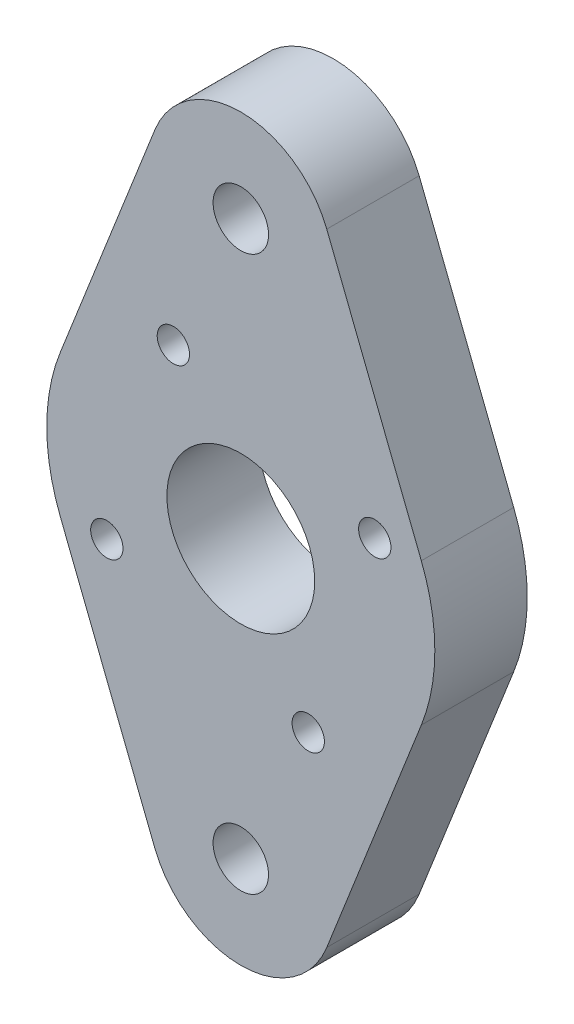
ISO-10303-21;
HEADER;
FILE_DESCRIPTION(('STEP AP214'),'2;1');
FILE_NAME('part.step','',(''),(''),'','','');
FILE_SCHEMA(('AUTOMOTIVE_DESIGN { 1 0 10303 214 1 1 1 1 }'));
ENDSEC;
DATA;
#1=APPLICATION_CONTEXT('core data for automotive mechanical design processes');
#2=APPLICATION_PROTOCOL_DEFINITION('international standard','automotive_design',2000,#1);
#3=PRODUCT_CONTEXT('',#1,'mechanical');
#4=PRODUCT('Part','Part','',(#3));
#5=PRODUCT_RELATED_PRODUCT_CATEGORY('part','',(#4));
#6=PRODUCT_DEFINITION_FORMATION('','',#4);
#7=PRODUCT_DEFINITION_CONTEXT('part definition',#1,'design');
#8=PRODUCT_DEFINITION('design','',#6,#7);
#9=PRODUCT_DEFINITION_SHAPE('','',#8);
#10=(LENGTH_UNIT() NAMED_UNIT(*) SI_UNIT(.MILLI.,.METRE.));
#11=(NAMED_UNIT(*) PLANE_ANGLE_UNIT() SI_UNIT($,.RADIAN.));
#12=(NAMED_UNIT(*) SI_UNIT($,.STERADIAN.) SOLID_ANGLE_UNIT());
#13=UNCERTAINTY_MEASURE_WITH_UNIT(LENGTH_MEASURE(1.E-05),#10,'distance_accuracy_value','');
#14=(GEOMETRIC_REPRESENTATION_CONTEXT(3) GLOBAL_UNCERTAINTY_ASSIGNED_CONTEXT((#13)) GLOBAL_UNIT_ASSIGNED_CONTEXT((#10,
#11,#12)) REPRESENTATION_CONTEXT('',''));
#15=CARTESIAN_POINT('',(0.,0.,0.));
#16=DIRECTION('',(0.,0.,1.));
#17=DIRECTION('',(1.,0.,0.));
#18=AXIS2_PLACEMENT_3D('',#15,#16,#17);
#19=CARTESIAN_POINT('',(0.,15.,5.));
#20=DIRECTION('',(0.,0.,-1.));
#21=DIRECTION('',(-1.,0.,0.));
#22=AXIS2_PLACEMENT_3D('',#19,#20,#21);
#23=PLANE('',#22);
#24=CARTESIAN_POINT('',(-3.65,7.25,5.));
#25=DIRECTION('',(0.,0.,1.));
#26=DIRECTION('',(1.,0.,0.));
#27=AXIS2_PLACEMENT_3D('',#24,#25,#26);
#28=CIRCLE('',#27,0.874999999999998);
#29=CARTESIAN_POINT('',(-2.775,7.25,5.));
#30=VERTEX_POINT('',#29);
#31=EDGE_CURVE('E206',#30,#30,#28,.T.);
#32=ORIENTED_EDGE('',*,*,#31,.F.);
#33=EDGE_LOOP('',(#32));
#34=FACE_BOUND('',#33,.T.);
#35=CARTESIAN_POINT('',(3.65,-7.25,5.));
#36=DIRECTION('',(0.,0.,1.));
#37=DIRECTION('',(1.,0.,0.));
#38=AXIS2_PLACEMENT_3D('',#35,#36,#37);
#39=CIRCLE('',#38,0.874999999999999);
#40=CARTESIAN_POINT('',(4.525,-7.25,5.));
#41=VERTEX_POINT('',#40);
#42=EDGE_CURVE('E194',#41,#41,#39,.T.);
#43=ORIENTED_EDGE('',*,*,#42,.F.);
#44=EDGE_LOOP('',(#43));
#45=FACE_BOUND('',#44,.T.);
#46=CARTESIAN_POINT('',(7.25,3.65,5.));
#47=DIRECTION('',(0.,0.,1.));
#48=DIRECTION('',(1.,0.,0.));
#49=AXIS2_PLACEMENT_3D('',#46,#47,#48);
#50=CIRCLE('',#49,0.874999999999999);
#51=CARTESIAN_POINT('',(8.125,3.65,5.));
#52=VERTEX_POINT('',#51);
#53=EDGE_CURVE('E182',#52,#52,#50,.T.);
#54=ORIENTED_EDGE('',*,*,#53,.F.);
#55=EDGE_LOOP('',(#54));
#56=FACE_BOUND('',#55,.T.);
#57=CARTESIAN_POINT('',(0.,15.,5.));
#58=DIRECTION('',(0.,0.,1.));
#59=DIRECTION('',(-1.,0.,0.));
#60=AXIS2_PLACEMENT_3D('',#57,#58,#59);
#61=CIRCLE('',#60,5.);
#62=CARTESIAN_POINT('',(4.65176191231762,16.8333333333333,5.));
#63=VERTEX_POINT('',#62);
#64=CARTESIAN_POINT('',(-4.65176191231762,16.8333333333333,5.));
#65=VERTEX_POINT('',#64);
#66=EDGE_CURVE('E145',#63,#65,#61,.T.);
#67=ORIENTED_EDGE('',*,*,#66,.T.);
#68=DIRECTION('',(-0.366666666666667,-0.930352382463524,0.));
#69=VECTOR('',#68,1.);
#70=CARTESIAN_POINT('',(-9.768700015867,3.85000000000001,5.));
#71=LINE('',#70,#69);
#72=CARTESIAN_POINT('',(-9.768700015867,3.85000000000001,5.));
#73=VERTEX_POINT('',#72);
#74=EDGE_CURVE('E93',#65,#73,#71,.T.);
#75=ORIENTED_EDGE('',*,*,#74,.T.);
#76=CARTESIAN_POINT('',(0.,0.,5.));
#77=DIRECTION('',(0.,0.,1.));
#78=DIRECTION('',(-1.,0.,0.));
#79=AXIS2_PLACEMENT_3D('',#76,#77,#78);
#80=CIRCLE('',#79,10.5);
#81=CARTESIAN_POINT('',(-9.768700015867,-3.85000000000001,5.));
#82=VERTEX_POINT('',#81);
#83=EDGE_CURVE('E160',#73,#82,#80,.T.);
#84=ORIENTED_EDGE('',*,*,#83,.T.);
#85=DIRECTION('',(0.366666666666667,-0.930352382463524,0.));
#86=VECTOR('',#85,1.);
#87=CARTESIAN_POINT('',(-9.768700015867,-3.85000000000001,5.));
#88=LINE('',#87,#86);
#89=CARTESIAN_POINT('',(-4.65176191231762,-16.8333333333333,5.));
#90=VERTEX_POINT('',#89);
#91=EDGE_CURVE('E173',#82,#90,#88,.T.);
#92=ORIENTED_EDGE('',*,*,#91,.T.);
#93=CARTESIAN_POINT('',(0.,-15.,5.));
#94=DIRECTION('',(0.,0.,1.));
#95=DIRECTION('',(1.,0.,0.));
#96=AXIS2_PLACEMENT_3D('',#93,#94,#95);
#97=CIRCLE('',#96,5.);
#98=CARTESIAN_POINT('',(4.65176191231762,-16.8333333333333,5.));
#99=VERTEX_POINT('',#98);
#100=EDGE_CURVE('E112',#90,#99,#97,.T.);
#101=ORIENTED_EDGE('',*,*,#100,.T.);
#102=DIRECTION('',(0.366666666666667,0.930352382463524,0.));
#103=VECTOR('',#102,1.);
#104=CARTESIAN_POINT('',(4.65176191231762,-16.8333333333333,5.));
#105=LINE('',#104,#103);
#106=CARTESIAN_POINT('',(9.768700015867,-3.85000000000001,5.));
#107=VERTEX_POINT('',#106);
#108=EDGE_CURVE('E106',#99,#107,#105,.T.);
#109=ORIENTED_EDGE('',*,*,#108,.T.);
#110=CARTESIAN_POINT('',(0.,0.,5.));
#111=DIRECTION('',(0.,0.,1.));
#112=DIRECTION('',(1.,0.,0.));
#113=AXIS2_PLACEMENT_3D('',#110,#111,#112);
#114=CIRCLE('',#113,10.5);
#115=CARTESIAN_POINT('',(9.768700015867,3.85000000000001,5.));
#116=VERTEX_POINT('',#115);
#117=EDGE_CURVE('E110',#107,#116,#114,.T.);
#118=ORIENTED_EDGE('',*,*,#117,.T.);
#119=DIRECTION('',(-0.366666666666667,0.930352382463524,0.));
#120=VECTOR('',#119,1.);
#121=CARTESIAN_POINT('',(4.65176191231762,16.8333333333333,5.));
#122=LINE('',#121,#120);
#123=EDGE_CURVE('E50',#116,#63,#122,.T.);
#124=ORIENTED_EDGE('',*,*,#123,.T.);
#125=EDGE_LOOP('',(#67,#75,#84,#92,#101,#109,#118,#124));
#126=FACE_BOUND('',#125,.T.);
#127=CARTESIAN_POINT('',(0.,0.,5.));
#128=DIRECTION('',(0.,0.,1.));
#129=DIRECTION('',(1.,0.,0.));
#130=AXIS2_PLACEMENT_3D('',#127,#128,#129);
#131=CIRCLE('',#130,4.);
#132=CARTESIAN_POINT('',(4.,0.,5.));
#133=VERTEX_POINT('',#132);
#134=EDGE_CURVE('E134',#133,#133,#131,.T.);
#135=ORIENTED_EDGE('',*,*,#134,.F.);
#136=EDGE_LOOP('',(#135));
#137=FACE_BOUND('',#136,.T.);
#138=CARTESIAN_POINT('',(0.,15.,5.));
#139=DIRECTION('',(0.,0.,1.));
#140=DIRECTION('',(1.,0.,0.));
#141=AXIS2_PLACEMENT_3D('',#138,#139,#140);
#142=CIRCLE('',#141,1.5);
#143=CARTESIAN_POINT('',(1.5,15.,5.));
#144=VERTEX_POINT('',#143);
#145=EDGE_CURVE('E188',#144,#144,#142,.T.);
#146=ORIENTED_EDGE('',*,*,#145,.F.);
#147=EDGE_LOOP('',(#146));
#148=FACE_BOUND('',#147,.T.);
#149=CARTESIAN_POINT('',(-7.25,-3.65,5.));
#150=DIRECTION('',(0.,0.,1.));
#151=DIRECTION('',(1.,0.,0.));
#152=AXIS2_PLACEMENT_3D('',#149,#150,#151);
#153=CIRCLE('',#152,0.874999999999999);
#154=CARTESIAN_POINT('',(-6.375,-3.65,5.));
#155=VERTEX_POINT('',#154);
#156=EDGE_CURVE('E200',#155,#155,#153,.T.);
#157=ORIENTED_EDGE('',*,*,#156,.F.);
#158=EDGE_LOOP('',(#157));
#159=FACE_BOUND('',#158,.T.);
#160=CARTESIAN_POINT('',(0.,-15.,5.));
#161=DIRECTION('',(0.,0.,1.));
#162=DIRECTION('',(-1.,0.,0.));
#163=AXIS2_PLACEMENT_3D('',#160,#161,#162);
#164=CIRCLE('',#163,1.5);
#165=CARTESIAN_POINT('',(-1.5,-15.,5.));
#166=VERTEX_POINT('',#165);
#167=EDGE_CURVE('E212',#166,#166,#164,.T.);
#168=ORIENTED_EDGE('',*,*,#167,.F.);
#169=EDGE_LOOP('',(#168));
#170=FACE_BOUND('',#169,.T.);
#171=ADVANCED_FACE('F33',(#34,#45,#56,#126,#137,#148,#159,#170),#23,.F.);
#172=CARTESIAN_POINT('',(0.,15.,0.));
#173=DIRECTION('',(0.,0.,-1.));
#174=DIRECTION('',(-1.,0.,0.));
#175=AXIS2_PLACEMENT_3D('',#172,#173,#174);
#176=PLANE('',#175);
#177=CARTESIAN_POINT('',(-3.65,7.25,0.));
#178=DIRECTION('',(0.,0.,1.));
#179=DIRECTION('',(1.,0.,0.));
#180=AXIS2_PLACEMENT_3D('',#177,#178,#179);
#181=CIRCLE('',#180,0.874999999999998);
#182=CARTESIAN_POINT('',(-2.775,7.25,0.));
#183=VERTEX_POINT('',#182);
#184=EDGE_CURVE('E209',#183,#183,#181,.T.);
#185=ORIENTED_EDGE('',*,*,#184,.T.);
#186=EDGE_LOOP('',(#185));
#187=FACE_BOUND('',#186,.T.);
#188=CARTESIAN_POINT('',(3.65,-7.25,0.));
#189=DIRECTION('',(0.,0.,1.));
#190=DIRECTION('',(1.,0.,0.));
#191=AXIS2_PLACEMENT_3D('',#188,#189,#190);
#192=CIRCLE('',#191,0.874999999999999);
#193=CARTESIAN_POINT('',(4.525,-7.25,0.));
#194=VERTEX_POINT('',#193);
#195=EDGE_CURVE('E197',#194,#194,#192,.T.);
#196=ORIENTED_EDGE('',*,*,#195,.T.);
#197=EDGE_LOOP('',(#196));
#198=FACE_BOUND('',#197,.T.);
#199=CARTESIAN_POINT('',(7.25,3.65,0.));
#200=DIRECTION('',(0.,0.,1.));
#201=DIRECTION('',(1.,0.,0.));
#202=AXIS2_PLACEMENT_3D('',#199,#200,#201);
#203=CIRCLE('',#202,0.874999999999999);
#204=CARTESIAN_POINT('',(8.125,3.65,0.));
#205=VERTEX_POINT('',#204);
#206=EDGE_CURVE('E185',#205,#205,#203,.T.);
#207=ORIENTED_EDGE('',*,*,#206,.T.);
#208=EDGE_LOOP('',(#207));
#209=FACE_BOUND('',#208,.T.);
#210=CARTESIAN_POINT('',(0.,15.,0.));
#211=DIRECTION('',(0.,0.,1.));
#212=DIRECTION('',(-1.,0.,0.));
#213=AXIS2_PLACEMENT_3D('',#210,#211,#212);
#214=CIRCLE('',#213,5.);
#215=CARTESIAN_POINT('',(4.65176191231762,16.8333333333333,0.));
#216=VERTEX_POINT('',#215);
#217=CARTESIAN_POINT('',(-4.65176191231762,16.8333333333333,0.));
#218=VERTEX_POINT('',#217);
#219=EDGE_CURVE('E130',#216,#218,#214,.T.);
#220=ORIENTED_EDGE('',*,*,#219,.F.);
#221=DIRECTION('',(-0.366666666666667,0.930352382463524,0.));
#222=VECTOR('',#221,1.);
#223=CARTESIAN_POINT('',(4.65176191231762,16.8333333333333,0.));
#224=LINE('',#223,#222);
#225=CARTESIAN_POINT('',(9.768700015867,3.85000000000001,0.));
#226=VERTEX_POINT('',#225);
#227=EDGE_CURVE('E85',#226,#216,#224,.T.);
#228=ORIENTED_EDGE('',*,*,#227,.F.);
#229=CARTESIAN_POINT('',(0.,0.,0.));
#230=DIRECTION('',(0.,0.,1.));
#231=DIRECTION('',(1.,0.,0.));
#232=AXIS2_PLACEMENT_3D('',#229,#230,#231);
#233=CIRCLE('',#232,10.5);
#234=CARTESIAN_POINT('',(9.768700015867,-3.85000000000001,0.));
#235=VERTEX_POINT('',#234);
#236=EDGE_CURVE('E79',#235,#226,#233,.T.);
#237=ORIENTED_EDGE('',*,*,#236,.F.);
#238=DIRECTION('',(0.366666666666667,0.930352382463524,0.));
#239=VECTOR('',#238,1.);
#240=CARTESIAN_POINT('',(4.65176191231762,-16.8333333333333,0.));
#241=LINE('',#240,#239);
#242=CARTESIAN_POINT('',(4.65176191231762,-16.8333333333333,0.));
#243=VERTEX_POINT('',#242);
#244=EDGE_CURVE('E120',#243,#235,#241,.T.);
#245=ORIENTED_EDGE('',*,*,#244,.F.);
#246=CARTESIAN_POINT('',(0.,-15.,0.));
#247=DIRECTION('',(0.,0.,1.));
#248=DIRECTION('',(1.,0.,0.));
#249=AXIS2_PLACEMENT_3D('',#246,#247,#248);
#250=CIRCLE('',#249,5.);
#251=CARTESIAN_POINT('',(-4.65176191231762,-16.8333333333333,0.));
#252=VERTEX_POINT('',#251);
#253=EDGE_CURVE('E140',#252,#243,#250,.T.);
#254=ORIENTED_EDGE('',*,*,#253,.F.);
#255=DIRECTION('',(0.366666666666667,-0.930352382463524,0.));
#256=VECTOR('',#255,1.);
#257=CARTESIAN_POINT('',(-9.768700015867,-3.85000000000001,0.));
#258=LINE('',#257,#256);
#259=CARTESIAN_POINT('',(-9.768700015867,-3.85000000000001,0.));
#260=VERTEX_POINT('',#259);
#261=EDGE_CURVE('E138',#260,#252,#258,.T.);
#262=ORIENTED_EDGE('',*,*,#261,.F.);
#263=CARTESIAN_POINT('',(0.,0.,0.));
#264=DIRECTION('',(0.,0.,1.));
#265=DIRECTION('',(-1.,0.,0.));
#266=AXIS2_PLACEMENT_3D('',#263,#264,#265);
#267=CIRCLE('',#266,10.5);
#268=CARTESIAN_POINT('',(-9.768700015867,3.85000000000001,0.));
#269=VERTEX_POINT('',#268);
#270=EDGE_CURVE('E136',#269,#260,#267,.T.);
#271=ORIENTED_EDGE('',*,*,#270,.F.);
#272=DIRECTION('',(-0.366666666666667,-0.930352382463524,0.));
#273=VECTOR('',#272,1.);
#274=CARTESIAN_POINT('',(-9.768700015867,3.85000000000001,0.));
#275=LINE('',#274,#273);
#276=EDGE_CURVE('E133',#218,#269,#275,.T.);
#277=ORIENTED_EDGE('',*,*,#276,.F.);
#278=EDGE_LOOP('',(#220,#228,#237,#245,#254,#262,#271,#277));
#279=FACE_BOUND('',#278,.T.);
#280=CARTESIAN_POINT('',(0.,0.,0.));
#281=DIRECTION('',(0.,0.,1.));
#282=DIRECTION('',(1.,0.,0.));
#283=AXIS2_PLACEMENT_3D('',#280,#281,#282);
#284=CIRCLE('',#283,4.);
#285=CARTESIAN_POINT('',(4.,0.,0.));
#286=VERTEX_POINT('',#285);
#287=EDGE_CURVE('E179',#286,#286,#284,.T.);
#288=ORIENTED_EDGE('',*,*,#287,.T.);
#289=EDGE_LOOP('',(#288));
#290=FACE_BOUND('',#289,.T.);
#291=CARTESIAN_POINT('',(0.,15.,0.));
#292=DIRECTION('',(0.,0.,1.));
#293=DIRECTION('',(1.,0.,0.));
#294=AXIS2_PLACEMENT_3D('',#291,#292,#293);
#295=CIRCLE('',#294,1.5);
#296=CARTESIAN_POINT('',(1.5,15.,0.));
#297=VERTEX_POINT('',#296);
#298=EDGE_CURVE('E191',#297,#297,#295,.T.);
#299=ORIENTED_EDGE('',*,*,#298,.T.);
#300=EDGE_LOOP('',(#299));
#301=FACE_BOUND('',#300,.T.);
#302=CARTESIAN_POINT('',(-7.25,-3.65,0.));
#303=DIRECTION('',(0.,0.,1.));
#304=DIRECTION('',(1.,0.,0.));
#305=AXIS2_PLACEMENT_3D('',#302,#303,#304);
#306=CIRCLE('',#305,0.874999999999999);
#307=CARTESIAN_POINT('',(-6.375,-3.65,0.));
#308=VERTEX_POINT('',#307);
#309=EDGE_CURVE('E203',#308,#308,#306,.T.);
#310=ORIENTED_EDGE('',*,*,#309,.T.);
#311=EDGE_LOOP('',(#310));
#312=FACE_BOUND('',#311,.T.);
#313=CARTESIAN_POINT('',(0.,-15.,0.));
#314=DIRECTION('',(0.,0.,1.));
#315=DIRECTION('',(-1.,0.,0.));
#316=AXIS2_PLACEMENT_3D('',#313,#314,#315);
#317=CIRCLE('',#316,1.5);
#318=CARTESIAN_POINT('',(-1.5,-15.,0.));
#319=VERTEX_POINT('',#318);
#320=EDGE_CURVE('E215',#319,#319,#317,.T.);
#321=ORIENTED_EDGE('',*,*,#320,.T.);
#322=EDGE_LOOP('',(#321));
#323=FACE_BOUND('',#322,.T.);
#324=ADVANCED_FACE('F164',(#187,#198,#209,#279,#290,#301,#312,#323),#176,.T.);
#325=CARTESIAN_POINT('',(0.,15.,5.));
#326=DIRECTION('',(0.,0.,-1.));
#327=DIRECTION('',(-1.,0.,0.));
#328=AXIS2_PLACEMENT_3D('',#325,#326,#327);
#329=CYLINDRICAL_SURFACE('',#328,5.);
#330=ORIENTED_EDGE('',*,*,#219,.T.);
#331=DIRECTION('',(0.,0.,-1.));
#332=VECTOR('',#331,1.);
#333=CARTESIAN_POINT('',(-4.65176191231762,16.8333333333333,5.));
#334=LINE('',#333,#332);
#335=EDGE_CURVE('E11',#65,#218,#334,.T.);
#336=ORIENTED_EDGE('',*,*,#335,.F.);
#337=ORIENTED_EDGE('',*,*,#66,.F.);
#338=DIRECTION('',(0.,0.,-1.));
#339=VECTOR('',#338,1.);
#340=CARTESIAN_POINT('',(4.65176191231762,16.8333333333333,5.));
#341=LINE('',#340,#339);
#342=EDGE_CURVE('E126',#63,#216,#341,.T.);
#343=ORIENTED_EDGE('',*,*,#342,.T.);
#344=EDGE_LOOP('',(#330,#336,#337,#343));
#345=FACE_BOUND('',#344,.T.);
#346=ADVANCED_FACE('F35',(#345),#329,.T.);
#347=CARTESIAN_POINT('',(-9.768700015867,3.85000000000001,5.));
#348=DIRECTION('',(0.930352382463524,-0.366666666666667,0.));
#349=DIRECTION('',(0.366666666666667,0.930352382463524,0.));
#350=AXIS2_PLACEMENT_3D('',#347,#348,#349);
#351=PLANE('',#350);
#352=ORIENTED_EDGE('',*,*,#276,.T.);
#353=DIRECTION('',(0.,0.,-1.));
#354=VECTOR('',#353,1.);
#355=CARTESIAN_POINT('',(-9.768700015867,3.85000000000001,5.));
#356=LINE('',#355,#354);
#357=EDGE_CURVE('E42',#73,#269,#356,.T.);
#358=ORIENTED_EDGE('',*,*,#357,.F.);
#359=ORIENTED_EDGE('',*,*,#74,.F.);
#360=ORIENTED_EDGE('',*,*,#335,.T.);
#361=EDGE_LOOP('',(#352,#358,#359,#360));
#362=FACE_BOUND('',#361,.T.);
#363=ADVANCED_FACE('F250',(#362),#351,.F.);
#364=CARTESIAN_POINT('',(0.,0.,5.));
#365=DIRECTION('',(0.,0.,-1.));
#366=DIRECTION('',(-1.,0.,0.));
#367=AXIS2_PLACEMENT_3D('',#364,#365,#366);
#368=CYLINDRICAL_SURFACE('',#367,10.5);
#369=ORIENTED_EDGE('',*,*,#270,.T.);
#370=DIRECTION('',(0.,0.,-1.));
#371=VECTOR('',#370,1.);
#372=CARTESIAN_POINT('',(-9.768700015867,-3.85000000000001,5.));
#373=LINE('',#372,#371);
#374=EDGE_CURVE('E152',#82,#260,#373,.T.);
#375=ORIENTED_EDGE('',*,*,#374,.F.);
#376=ORIENTED_EDGE('',*,*,#83,.F.);
#377=ORIENTED_EDGE('',*,*,#357,.T.);
#378=EDGE_LOOP('',(#369,#375,#376,#377));
#379=FACE_BOUND('',#378,.T.);
#380=ADVANCED_FACE('F158',(#379),#368,.T.);
#381=CARTESIAN_POINT('',(-9.768700015867,-3.85000000000001,5.));
#382=DIRECTION('',(0.930352382463524,0.366666666666667,0.));
#383=DIRECTION('',(-0.366666666666667,0.930352382463524,0.));
#384=AXIS2_PLACEMENT_3D('',#381,#382,#383);
#385=PLANE('',#384);
#386=ORIENTED_EDGE('',*,*,#261,.T.);
#387=DIRECTION('',(0.,0.,-1.));
#388=VECTOR('',#387,1.);
#389=CARTESIAN_POINT('',(-4.65176191231762,-16.8333333333333,5.));
#390=LINE('',#389,#388);
#391=EDGE_CURVE('E149',#90,#252,#390,.T.);
#392=ORIENTED_EDGE('',*,*,#391,.F.);
#393=ORIENTED_EDGE('',*,*,#91,.F.);
#394=ORIENTED_EDGE('',*,*,#374,.T.);
#395=EDGE_LOOP('',(#386,#392,#393,#394));
#396=FACE_BOUND('',#395,.T.);
#397=ADVANCED_FACE('F169',(#396),#385,.F.);
#398=CARTESIAN_POINT('',(0.,-15.,5.));
#399=DIRECTION('',(0.,0.,-1.));
#400=DIRECTION('',(-1.,0.,0.));
#401=AXIS2_PLACEMENT_3D('',#398,#399,#400);
#402=CYLINDRICAL_SURFACE('',#401,5.);
#403=ORIENTED_EDGE('',*,*,#253,.T.);
#404=DIRECTION('',(0.,0.,-1.));
#405=VECTOR('',#404,1.);
#406=CARTESIAN_POINT('',(4.65176191231762,-16.8333333333333,5.));
#407=LINE('',#406,#405);
#408=EDGE_CURVE('E121',#99,#243,#407,.T.);
#409=ORIENTED_EDGE('',*,*,#408,.F.);
#410=ORIENTED_EDGE('',*,*,#100,.F.);
#411=ORIENTED_EDGE('',*,*,#391,.T.);
#412=EDGE_LOOP('',(#403,#409,#410,#411));
#413=FACE_BOUND('',#412,.T.);
#414=ADVANCED_FACE('F172',(#413),#402,.T.);
#415=CARTESIAN_POINT('',(4.65176191231762,-16.8333333333333,5.));
#416=DIRECTION('',(-0.930352382463524,0.366666666666667,0.));
#417=DIRECTION('',(-0.366666666666667,-0.930352382463524,0.));
#418=AXIS2_PLACEMENT_3D('',#415,#416,#417);
#419=PLANE('',#418);
#420=ORIENTED_EDGE('',*,*,#244,.T.);
#421=DIRECTION('',(0.,0.,-1.));
#422=VECTOR('',#421,1.);
#423=CARTESIAN_POINT('',(9.768700015867,-3.85000000000001,5.));
#424=LINE('',#423,#422);
#425=EDGE_CURVE('E117',#107,#235,#424,.T.);
#426=ORIENTED_EDGE('',*,*,#425,.F.);
#427=ORIENTED_EDGE('',*,*,#108,.F.);
#428=ORIENTED_EDGE('',*,*,#408,.T.);
#429=EDGE_LOOP('',(#420,#426,#427,#428));
#430=FACE_BOUND('',#429,.T.);
#431=ADVANCED_FACE('F118',(#430),#419,.F.);
#432=CARTESIAN_POINT('',(0.,0.,5.));
#433=DIRECTION('',(0.,0.,-1.));
#434=DIRECTION('',(-1.,0.,0.));
#435=AXIS2_PLACEMENT_3D('',#432,#433,#434);
#436=CYLINDRICAL_SURFACE('',#435,10.5);
#437=ORIENTED_EDGE('',*,*,#236,.T.);
#438=DIRECTION('',(0.,0.,-1.));
#439=VECTOR('',#438,1.);
#440=CARTESIAN_POINT('',(9.768700015867,3.85000000000001,5.));
#441=LINE('',#440,#439);
#442=EDGE_CURVE('E122',#116,#226,#441,.T.);
#443=ORIENTED_EDGE('',*,*,#442,.F.);
#444=ORIENTED_EDGE('',*,*,#117,.F.);
#445=ORIENTED_EDGE('',*,*,#425,.T.);
#446=EDGE_LOOP('',(#437,#443,#444,#445));
#447=FACE_BOUND('',#446,.T.);
#448=ADVANCED_FACE('F124',(#447),#436,.T.);
#449=CARTESIAN_POINT('',(4.65176191231762,16.8333333333333,5.));
#450=DIRECTION('',(-0.930352382463524,-0.366666666666667,0.));
#451=DIRECTION('',(0.366666666666667,-0.930352382463524,0.));
#452=AXIS2_PLACEMENT_3D('',#449,#450,#451);
#453=PLANE('',#452);
#454=ORIENTED_EDGE('',*,*,#227,.T.);
#455=ORIENTED_EDGE('',*,*,#342,.F.);
#456=ORIENTED_EDGE('',*,*,#123,.F.);
#457=ORIENTED_EDGE('',*,*,#442,.T.);
#458=EDGE_LOOP('',(#454,#455,#456,#457));
#459=FACE_BOUND('',#458,.T.);
#460=ADVANCED_FACE('F238',(#459),#453,.F.);
#461=CARTESIAN_POINT('',(0.,0.,5.));
#462=DIRECTION('',(0.,0.,-1.));
#463=DIRECTION('',(-1.,0.,0.));
#464=AXIS2_PLACEMENT_3D('',#461,#462,#463);
#465=CYLINDRICAL_SURFACE('',#464,4.);
#466=ORIENTED_EDGE('',*,*,#134,.T.);
#467=EDGE_LOOP('',(#466));
#468=FACE_BOUND('',#467,.T.);
#469=ORIENTED_EDGE('',*,*,#287,.F.);
#470=EDGE_LOOP('',(#469));
#471=FACE_BOUND('',#470,.T.);
#472=ADVANCED_FACE('F235',(#468,#471),#465,.F.);
#473=CARTESIAN_POINT('',(7.25,3.65,5.));
#474=DIRECTION('',(0.,0.,-1.));
#475=DIRECTION('',(-1.,0.,0.));
#476=AXIS2_PLACEMENT_3D('',#473,#474,#475);
#477=CYLINDRICAL_SURFACE('',#476,0.874999999999999);
#478=ORIENTED_EDGE('',*,*,#53,.T.);
#479=EDGE_LOOP('',(#478));
#480=FACE_BOUND('',#479,.T.);
#481=ORIENTED_EDGE('',*,*,#206,.F.);
#482=EDGE_LOOP('',(#481));
#483=FACE_BOUND('',#482,.T.);
#484=ADVANCED_FACE('F314',(#480,#483),#477,.F.);
#485=CARTESIAN_POINT('',(0.,15.,5.));
#486=DIRECTION('',(0.,0.,-1.));
#487=DIRECTION('',(-1.,0.,0.));
#488=AXIS2_PLACEMENT_3D('',#485,#486,#487);
#489=CYLINDRICAL_SURFACE('',#488,1.5);
#490=ORIENTED_EDGE('',*,*,#145,.T.);
#491=EDGE_LOOP('',(#490));
#492=FACE_BOUND('',#491,.T.);
#493=ORIENTED_EDGE('',*,*,#298,.F.);
#494=EDGE_LOOP('',(#493));
#495=FACE_BOUND('',#494,.T.);
#496=ADVANCED_FACE('F322',(#492,#495),#489,.F.);
#497=CARTESIAN_POINT('',(3.65,-7.25,5.));
#498=DIRECTION('',(0.,0.,-1.));
#499=DIRECTION('',(-1.,0.,0.));
#500=AXIS2_PLACEMENT_3D('',#497,#498,#499);
#501=CYLINDRICAL_SURFACE('',#500,0.874999999999999);
#502=ORIENTED_EDGE('',*,*,#42,.T.);
#503=EDGE_LOOP('',(#502));
#504=FACE_BOUND('',#503,.T.);
#505=ORIENTED_EDGE('',*,*,#195,.F.);
#506=EDGE_LOOP('',(#505));
#507=FACE_BOUND('',#506,.T.);
#508=ADVANCED_FACE('F330',(#504,#507),#501,.F.);
#509=CARTESIAN_POINT('',(-7.25,-3.65,5.));
#510=DIRECTION('',(0.,0.,-1.));
#511=DIRECTION('',(-1.,0.,0.));
#512=AXIS2_PLACEMENT_3D('',#509,#510,#511);
#513=CYLINDRICAL_SURFACE('',#512,0.874999999999999);
#514=ORIENTED_EDGE('',*,*,#156,.T.);
#515=EDGE_LOOP('',(#514));
#516=FACE_BOUND('',#515,.T.);
#517=ORIENTED_EDGE('',*,*,#309,.F.);
#518=EDGE_LOOP('',(#517));
#519=FACE_BOUND('',#518,.T.);
#520=ADVANCED_FACE('F339',(#516,#519),#513,.F.);
#521=CARTESIAN_POINT('',(-3.65,7.25,5.));
#522=DIRECTION('',(0.,0.,-1.));
#523=DIRECTION('',(-1.,0.,0.));
#524=AXIS2_PLACEMENT_3D('',#521,#522,#523);
#525=CYLINDRICAL_SURFACE('',#524,0.874999999999998);
#526=ORIENTED_EDGE('',*,*,#31,.T.);
#527=EDGE_LOOP('',(#526));
#528=FACE_BOUND('',#527,.T.);
#529=ORIENTED_EDGE('',*,*,#184,.F.);
#530=EDGE_LOOP('',(#529));
#531=FACE_BOUND('',#530,.T.);
#532=ADVANCED_FACE('F348',(#528,#531),#525,.F.);
#533=CARTESIAN_POINT('',(0.,-15.,5.));
#534=DIRECTION('',(0.,0.,-1.));
#535=DIRECTION('',(-1.,0.,0.));
#536=AXIS2_PLACEMENT_3D('',#533,#534,#535);
#537=CYLINDRICAL_SURFACE('',#536,1.5);
#538=ORIENTED_EDGE('',*,*,#167,.T.);
#539=EDGE_LOOP('',(#538));
#540=FACE_BOUND('',#539,.T.);
#541=ORIENTED_EDGE('',*,*,#320,.F.);
#542=EDGE_LOOP('',(#541));
#543=FACE_BOUND('',#542,.T.);
#544=ADVANCED_FACE('F221',(#540,#543),#537,.F.);
#545=CLOSED_SHELL('',(#171,#324,#346,#363,#380,#397,#414,#431,#448,#460,#472,#484,#496,#508,
#520,#532,#544));
#546=MANIFOLD_SOLID_BREP('B2',#545);
#547=ADVANCED_BREP_SHAPE_REPRESENTATION('',(#18,#546),#14);
#548=SHAPE_DEFINITION_REPRESENTATION(#9,#547);
ENDSEC;
END-ISO-10303-21;
